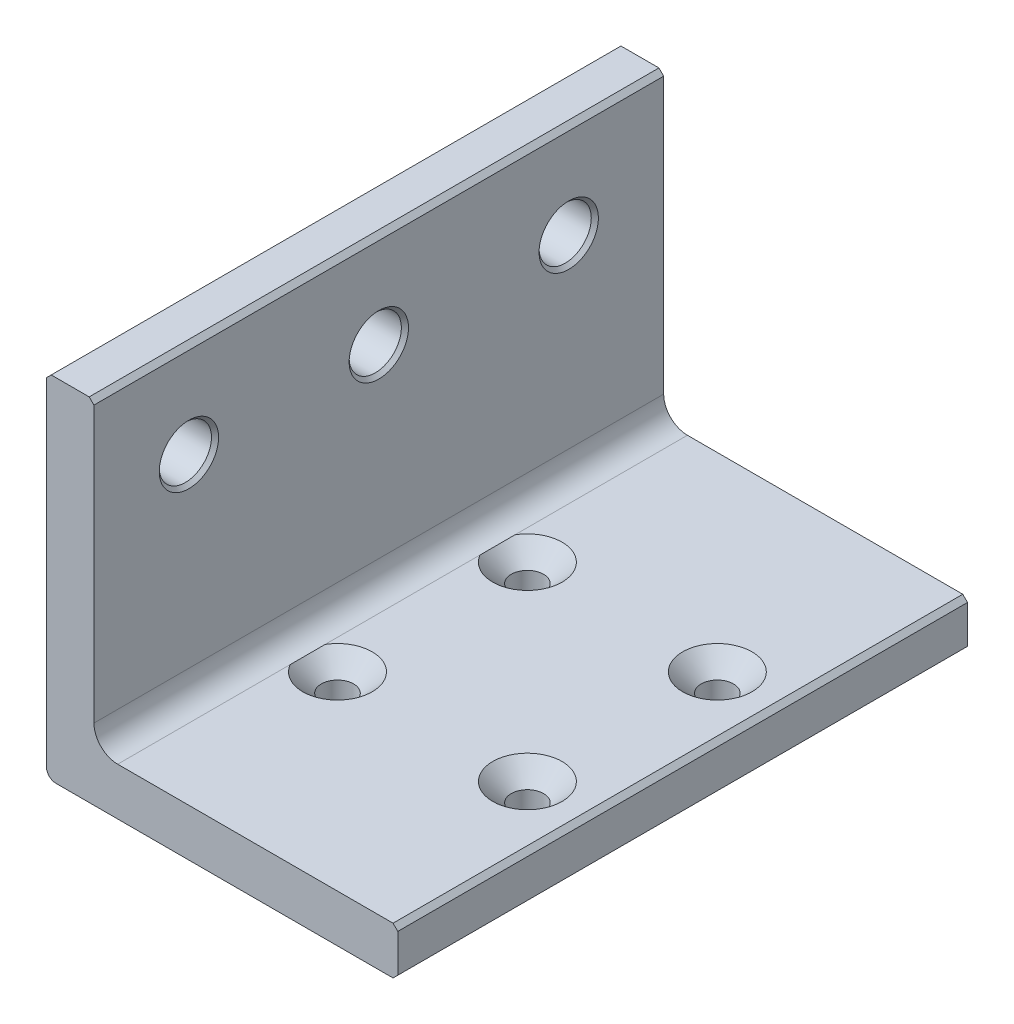
ISO-10303-21;
HEADER;
FILE_DESCRIPTION(('STEP AP214'),'2;1');
FILE_NAME('part.step','',(''),(''),'','','');
FILE_SCHEMA(('AUTOMOTIVE_DESIGN { 1 0 10303 214 1 1 1 1 }'));
ENDSEC;
DATA;
#1=APPLICATION_CONTEXT('core data for automotive mechanical design processes');
#2=APPLICATION_PROTOCOL_DEFINITION('international standard','automotive_design',2000,#1);
#3=PRODUCT_CONTEXT('',#1,'mechanical');
#4=PRODUCT('Part','Part','',(#3));
#5=PRODUCT_RELATED_PRODUCT_CATEGORY('part','',(#4));
#6=PRODUCT_DEFINITION_FORMATION('','',#4);
#7=PRODUCT_DEFINITION_CONTEXT('part definition',#1,'design');
#8=PRODUCT_DEFINITION('design','',#6,#7);
#9=PRODUCT_DEFINITION_SHAPE('','',#8);
#10=(LENGTH_UNIT() NAMED_UNIT(*) SI_UNIT(.MILLI.,.METRE.));
#11=(NAMED_UNIT(*) PLANE_ANGLE_UNIT() SI_UNIT($,.RADIAN.));
#12=(NAMED_UNIT(*) SI_UNIT($,.STERADIAN.) SOLID_ANGLE_UNIT());
#13=UNCERTAINTY_MEASURE_WITH_UNIT(LENGTH_MEASURE(1.E-05),#10,'distance_accuracy_value','');
#14=(GEOMETRIC_REPRESENTATION_CONTEXT(3) GLOBAL_UNCERTAINTY_ASSIGNED_CONTEXT((#13)) GLOBAL_UNIT_ASSIGNED_CONTEXT((#10,
#11,#12)) REPRESENTATION_CONTEXT('',''));
#15=CARTESIAN_POINT('',(0.,0.,0.));
#16=DIRECTION('',(0.,0.,1.));
#17=DIRECTION('',(1.,0.,0.));
#18=AXIS2_PLACEMENT_3D('',#15,#16,#17);
#19=CARTESIAN_POINT('',(14.5544718164469,-14.7922738190553,60.));
#20=DIRECTION('',(0.,-1.,0.));
#21=DIRECTION('',(1.,0.,0.));
#22=AXIS2_PLACEMENT_3D('',#19,#20,#21);
#23=PLANE('',#22);
#24=CARTESIAN_POINT('',(8.70447181644686,-14.7922738190553,40.));
#25=DIRECTION('',(0.,1.,0.));
#26=DIRECTION('',(0.,0.,1.));
#27=AXIS2_PLACEMENT_3D('',#24,#25,#26);
#28=CIRCLE('',#27,3.65);
#29=CARTESIAN_POINT('',(8.70447181644686,-14.7922738190553,43.65));
#30=VERTEX_POINT('',#29);
#31=EDGE_CURVE('E368',#30,#30,#28,.T.);
#32=ORIENTED_EDGE('',*,*,#31,.F.);
#33=EDGE_LOOP('',(#32));
#34=FACE_BOUND('',#33,.T.);
#35=DIRECTION('',(0.,0.,-1.));
#36=VECTOR('',#35,1.);
#37=CARTESIAN_POINT('',(-14.4455281835531,-14.7922738190553,60.));
#38=LINE('',#37,#36);
#39=CARTESIAN_POINT('',(-14.4455281835531,-14.7922738190553,38.1560911085414));
#40=VERTEX_POINT('',#39);
#41=CARTESIAN_POINT('',(-14.4455281835531,-14.7922738190553,21.8439088914586));
#42=VERTEX_POINT('',#41);
#43=EDGE_CURVE('E54',#40,#42,#38,.T.);
#44=ORIENTED_EDGE('',*,*,#43,.F.);
#45=CARTESIAN_POINT('',(-11.2955281835531,-14.7922738190553,40.));
#46=DIRECTION('',(0.,1.,0.));
#47=DIRECTION('',(0.,0.,1.));
#48=AXIS2_PLACEMENT_3D('',#45,#46,#47);
#49=CIRCLE('',#48,3.65);
#50=CARTESIAN_POINT('',(-14.4455281835531,-14.7922738190553,41.8439088914586));
#51=VERTEX_POINT('',#50);
#52=EDGE_CURVE('E133',#51,#40,#49,.T.);
#53=ORIENTED_EDGE('',*,*,#52,.F.);
#54=CARTESIAN_POINT('',(-14.4455281835531,-14.7922738190553,60.));
#55=VERTEX_POINT('',#54);
#56=EDGE_CURVE('E150',#55,#51,#38,.T.);
#57=ORIENTED_EDGE('',*,*,#56,.F.);
#58=DIRECTION('',(-1.,0.,0.));
#59=VECTOR('',#58,1.);
#60=CARTESIAN_POINT('',(14.5544718164469,-14.7922738190553,60.));
#61=LINE('',#60,#59);
#62=CARTESIAN_POINT('',(14.5544718164469,-14.7922738190553,60.));
#63=VERTEX_POINT('',#62);
#64=EDGE_CURVE('E157',#63,#55,#61,.T.);
#65=ORIENTED_EDGE('',*,*,#64,.F.);
#66=DIRECTION('',(0.,0.,-1.));
#67=VECTOR('',#66,1.);
#68=CARTESIAN_POINT('',(14.5544718164469,-14.7922738190553,60.));
#69=LINE('',#68,#67);
#70=CARTESIAN_POINT('',(14.5544718164469,-14.7922738190553,0.));
#71=VERTEX_POINT('',#70);
#72=EDGE_CURVE('E154',#63,#71,#69,.T.);
#73=ORIENTED_EDGE('',*,*,#72,.T.);
#74=DIRECTION('',(-1.,0.,0.));
#75=VECTOR('',#74,1.);
#76=CARTESIAN_POINT('',(14.5544718164469,-14.7922738190553,0.));
#77=LINE('',#76,#75);
#78=CARTESIAN_POINT('',(-14.4455281835531,-14.7922738190553,0.));
#79=VERTEX_POINT('',#78);
#80=EDGE_CURVE('E190',#71,#79,#77,.T.);
#81=ORIENTED_EDGE('',*,*,#80,.T.);
#82=CARTESIAN_POINT('',(-14.4455281835531,-14.7922738190553,18.1560911085414));
#83=VERTEX_POINT('',#82);
#84=EDGE_CURVE('E153',#83,#79,#38,.T.);
#85=ORIENTED_EDGE('',*,*,#84,.F.);
#86=CARTESIAN_POINT('',(-11.2955281835531,-14.7922738190553,20.));
#87=DIRECTION('',(0.,1.,0.));
#88=DIRECTION('',(0.,0.,1.));
#89=AXIS2_PLACEMENT_3D('',#86,#87,#88);
#90=CIRCLE('',#89,3.65);
#91=EDGE_CURVE('E147',#42,#83,#90,.T.);
#92=ORIENTED_EDGE('',*,*,#91,.F.);
#93=EDGE_LOOP('',(#44,#53,#57,#65,#73,#81,#85,#92));
#94=FACE_BOUND('',#93,.T.);
#95=CARTESIAN_POINT('',(8.70447181644686,-14.7922738190553,20.));
#96=DIRECTION('',(0.,1.,0.));
#97=DIRECTION('',(0.,0.,1.));
#98=AXIS2_PLACEMENT_3D('',#95,#96,#97);
#99=CIRCLE('',#98,3.65);
#100=CARTESIAN_POINT('',(8.70447181644686,-14.7922738190553,23.65));
#101=VERTEX_POINT('',#100);
#102=EDGE_CURVE('E380',#101,#101,#99,.T.);
#103=ORIENTED_EDGE('',*,*,#102,.F.);
#104=EDGE_LOOP('',(#103));
#105=FACE_BOUND('',#104,.T.);
#106=ADVANCED_FACE('F32',(#34,#94,#105),#23,.F.);
#107=CARTESIAN_POINT('',(-14.4455281835531,-12.2922738190553,60.));
#108=DIRECTION('',(0.,0.,-1.));
#109=DIRECTION('',(-1.,0.,0.));
#110=AXIS2_PLACEMENT_3D('',#107,#108,#109);
#111=CYLINDRICAL_SURFACE('',#110,2.5);
#112=CARTESIAN_POINT('',(-14.4455281835531,-12.2922738190553,0.));
#113=DIRECTION('',(0.,0.,-1.));
#114=DIRECTION('',(-1.,0.,0.));
#115=AXIS2_PLACEMENT_3D('',#112,#113,#114);
#116=CIRCLE('',#115,2.5);
#117=CARTESIAN_POINT('',(-16.9455281835531,-12.2922738190552,0.));
#118=VERTEX_POINT('',#117);
#119=EDGE_CURVE('E168',#79,#118,#116,.T.);
#120=ORIENTED_EDGE('',*,*,#119,.T.);
#121=DIRECTION('',(0.,0.,-1.));
#122=VECTOR('',#121,1.);
#123=CARTESIAN_POINT('',(-16.9455281835531,-12.2922738190552,60.));
#124=LINE('',#123,#122);
#125=CARTESIAN_POINT('',(-16.9455281835531,-12.2922738190552,60.));
#126=VERTEX_POINT('',#125);
#127=EDGE_CURVE('E11',#126,#118,#124,.T.);
#128=ORIENTED_EDGE('',*,*,#127,.F.);
#129=CARTESIAN_POINT('',(-14.4455281835531,-12.2922738190553,60.));
#130=DIRECTION('',(0.,0.,-1.));
#131=DIRECTION('',(-1.,0.,0.));
#132=AXIS2_PLACEMENT_3D('',#129,#130,#131);
#133=CIRCLE('',#132,2.5);
#134=EDGE_CURVE('E191',#55,#126,#133,.T.);
#135=ORIENTED_EDGE('',*,*,#134,.F.);
#136=ORIENTED_EDGE('',*,*,#56,.T.);
#137=EDGE_CURVE('E142',#51,#40,#38,.T.);
#138=ORIENTED_EDGE('',*,*,#137,.T.);
#139=ORIENTED_EDGE('',*,*,#43,.T.);
#140=EDGE_CURVE('E148',#42,#83,#38,.T.);
#141=ORIENTED_EDGE('',*,*,#140,.T.);
#142=ORIENTED_EDGE('',*,*,#84,.T.);
#143=EDGE_LOOP('',(#120,#128,#135,#136,#138,#139,#141,#142));
#144=FACE_BOUND('',#143,.T.);
#145=ADVANCED_FACE('F34',(#144),#111,.F.);
#146=CARTESIAN_POINT('',(-16.9455281835531,-12.2922738190552,60.));
#147=DIRECTION('',(-1.,0.,0.));
#148=DIRECTION('',(0.,-1.,0.));
#149=AXIS2_PLACEMENT_3D('',#146,#147,#148);
#150=PLANE('',#149);
#151=CARTESIAN_POINT('',(-16.9455281835531,7.20772618094474,50.));
#152=DIRECTION('',(1.,0.,0.));
#153=DIRECTION('',(0.,0.,-1.));
#154=AXIS2_PLACEMENT_3D('',#151,#152,#153);
#155=CIRCLE('',#154,3.125);
#156=CARTESIAN_POINT('',(-16.9455281835531,7.20772618094474,46.875));
#157=VERTEX_POINT('',#156);
#158=EDGE_CURVE('E336',#157,#157,#155,.T.);
#159=ORIENTED_EDGE('',*,*,#158,.F.);
#160=EDGE_LOOP('',(#159));
#161=FACE_BOUND('',#160,.T.);
#162=CARTESIAN_POINT('',(-16.9455281835531,7.20772618094474,30.));
#163=DIRECTION('',(1.,0.,0.));
#164=DIRECTION('',(0.,0.,-1.));
#165=AXIS2_PLACEMENT_3D('',#162,#163,#164);
#166=CIRCLE('',#165,3.125);
#167=CARTESIAN_POINT('',(-16.9455281835531,7.20772618094474,26.875));
#168=VERTEX_POINT('',#167);
#169=EDGE_CURVE('E340',#168,#168,#166,.T.);
#170=ORIENTED_EDGE('',*,*,#169,.F.);
#171=EDGE_LOOP('',(#170));
#172=FACE_BOUND('',#171,.T.);
#173=CARTESIAN_POINT('',(-16.9455281835531,7.20772618094474,9.99999999999999));
#174=DIRECTION('',(1.,0.,0.));
#175=DIRECTION('',(0.,0.,-1.));
#176=AXIS2_PLACEMENT_3D('',#173,#174,#175);
#177=CIRCLE('',#176,3.125);
#178=CARTESIAN_POINT('',(-16.9455281835531,7.20772618094474,6.87499999999999));
#179=VERTEX_POINT('',#178);
#180=EDGE_CURVE('E343',#179,#179,#177,.T.);
#181=ORIENTED_EDGE('',*,*,#180,.F.);
#182=EDGE_LOOP('',(#181));
#183=FACE_BOUND('',#182,.T.);
#184=DIRECTION('',(0.,1.,0.));
#185=VECTOR('',#184,1.);
#186=CARTESIAN_POINT('',(-16.9455281835531,-12.2922738190552,0.));
#187=LINE('',#186,#185);
#188=CARTESIAN_POINT('',(-16.9455281835531,16.7077261809447,0.));
#189=VERTEX_POINT('',#188);
#190=EDGE_CURVE('E170',#118,#189,#187,.T.);
#191=ORIENTED_EDGE('',*,*,#190,.T.);
#192=DIRECTION('',(0.,0.,-1.));
#193=VECTOR('',#192,1.);
#194=CARTESIAN_POINT('',(-16.9455281835531,16.7077261809447,60.));
#195=LINE('',#194,#193);
#196=CARTESIAN_POINT('',(-16.9455281835531,16.7077261809447,60.));
#197=VERTEX_POINT('',#196);
#198=EDGE_CURVE('E40',#197,#189,#195,.T.);
#199=ORIENTED_EDGE('',*,*,#198,.F.);
#200=DIRECTION('',(0.,1.,0.));
#201=VECTOR('',#200,1.);
#202=CARTESIAN_POINT('',(-16.9455281835531,-12.2922738190552,60.));
#203=LINE('',#202,#201);
#204=EDGE_CURVE('E195',#126,#197,#203,.T.);
#205=ORIENTED_EDGE('',*,*,#204,.F.);
#206=ORIENTED_EDGE('',*,*,#127,.T.);
#207=EDGE_LOOP('',(#191,#199,#205,#206));
#208=FACE_BOUND('',#207,.T.);
#209=ADVANCED_FACE('F234',(#161,#172,#183,#208),#150,.F.);
#210=CARTESIAN_POINT('',(-16.9455281835531,16.7077261809447,60.));
#211=DIRECTION('',(-0.707106781186547,-0.707106781186547,0.));
#212=DIRECTION('',(0.707106781186548,-0.707106781186548,0.));
#213=AXIS2_PLACEMENT_3D('',#210,#211,#212);
#214=PLANE('',#213);
#215=DIRECTION('',(-0.707106781186547,0.707106781186547,0.));
#216=VECTOR('',#215,1.);
#217=CARTESIAN_POINT('',(-16.9455281835531,16.7077261809447,0.));
#218=LINE('',#217,#216);
#219=CARTESIAN_POINT('',(-17.4455281835531,17.2077261809447,0.));
#220=VERTEX_POINT('',#219);
#221=EDGE_CURVE('E173',#189,#220,#218,.T.);
#222=ORIENTED_EDGE('',*,*,#221,.T.);
#223=DIRECTION('',(0.,0.,-1.));
#224=VECTOR('',#223,1.);
#225=CARTESIAN_POINT('',(-17.4455281835531,17.2077261809447,60.));
#226=LINE('',#225,#224);
#227=CARTESIAN_POINT('',(-17.4455281835531,17.2077261809447,60.));
#228=VERTEX_POINT('',#227);
#229=EDGE_CURVE('E243',#228,#220,#226,.T.);
#230=ORIENTED_EDGE('',*,*,#229,.F.);
#231=DIRECTION('',(-0.707106781186547,0.707106781186547,0.));
#232=VECTOR('',#231,1.);
#233=CARTESIAN_POINT('',(-16.9455281835531,16.7077261809447,60.));
#234=LINE('',#233,#232);
#235=EDGE_CURVE('E198',#197,#228,#234,.T.);
#236=ORIENTED_EDGE('',*,*,#235,.F.);
#237=ORIENTED_EDGE('',*,*,#198,.T.);
#238=EDGE_LOOP('',(#222,#230,#236,#237));
#239=FACE_BOUND('',#238,.T.);
#240=ADVANCED_FACE('F244',(#239),#214,.F.);
#241=CARTESIAN_POINT('',(-17.4455281835531,17.2077261809447,60.));
#242=DIRECTION('',(0.,-1.,0.));
#243=DIRECTION('',(0.,0.,-1.));
#244=AXIS2_PLACEMENT_3D('',#241,#242,#243);
#245=PLANE('',#244);
#246=DIRECTION('',(-1.,0.,0.));
#247=VECTOR('',#246,1.);
#248=CARTESIAN_POINT('',(-17.4455281835531,17.2077261809447,0.));
#249=LINE('',#248,#247);
#250=CARTESIAN_POINT('',(-21.4455281835531,17.2077261809447,0.));
#251=VERTEX_POINT('',#250);
#252=EDGE_CURVE('E175',#220,#251,#249,.T.);
#253=ORIENTED_EDGE('',*,*,#252,.T.);
#254=DIRECTION('',(0.,0.,-1.));
#255=VECTOR('',#254,1.);
#256=CARTESIAN_POINT('',(-21.4455281835531,17.2077261809447,60.));
#257=LINE('',#256,#255);
#258=CARTESIAN_POINT('',(-21.4455281835531,17.2077261809447,60.));
#259=VERTEX_POINT('',#258);
#260=EDGE_CURVE('E248',#259,#251,#257,.T.);
#261=ORIENTED_EDGE('',*,*,#260,.F.);
#262=DIRECTION('',(-1.,0.,0.));
#263=VECTOR('',#262,1.);
#264=CARTESIAN_POINT('',(-17.4455281835531,17.2077261809447,60.));
#265=LINE('',#264,#263);
#266=EDGE_CURVE('E204',#228,#259,#265,.T.);
#267=ORIENTED_EDGE('',*,*,#266,.F.);
#268=ORIENTED_EDGE('',*,*,#229,.T.);
#269=EDGE_LOOP('',(#253,#261,#267,#268));
#270=FACE_BOUND('',#269,.T.);
#271=ADVANCED_FACE('F250',(#270),#245,.F.);
#272=CARTESIAN_POINT('',(-21.4455281835531,17.2077261809447,60.));
#273=DIRECTION('',(0.707106781186547,-0.707106781186547,0.));
#274=DIRECTION('',(0.707106781186548,0.707106781186548,0.));
#275=AXIS2_PLACEMENT_3D('',#272,#273,#274);
#276=PLANE('',#275);
#277=DIRECTION('',(-0.707106781186547,-0.707106781186547,0.));
#278=VECTOR('',#277,1.);
#279=CARTESIAN_POINT('',(-21.4455281835531,17.2077261809447,0.));
#280=LINE('',#279,#278);
#281=CARTESIAN_POINT('',(-21.9455281835531,16.7077261809447,0.));
#282=VERTEX_POINT('',#281);
#283=EDGE_CURVE('E177',#251,#282,#280,.T.);
#284=ORIENTED_EDGE('',*,*,#283,.T.);
#285=DIRECTION('',(0.,0.,-1.));
#286=VECTOR('',#285,1.);
#287=CARTESIAN_POINT('',(-21.9455281835531,16.7077261809447,60.));
#288=LINE('',#287,#286);
#289=CARTESIAN_POINT('',(-21.9455281835531,16.7077261809447,60.));
#290=VERTEX_POINT('',#289);
#291=EDGE_CURVE('E255',#290,#282,#288,.T.);
#292=ORIENTED_EDGE('',*,*,#291,.F.);
#293=DIRECTION('',(-0.707106781186547,-0.707106781186547,0.));
#294=VECTOR('',#293,1.);
#295=CARTESIAN_POINT('',(-21.4455281835531,17.2077261809447,60.));
#296=LINE('',#295,#294);
#297=EDGE_CURVE('E206',#259,#290,#296,.T.);
#298=ORIENTED_EDGE('',*,*,#297,.F.);
#299=ORIENTED_EDGE('',*,*,#260,.T.);
#300=EDGE_LOOP('',(#284,#292,#298,#299));
#301=FACE_BOUND('',#300,.T.);
#302=ADVANCED_FACE('F258',(#301),#276,.F.);
#303=CARTESIAN_POINT('',(-21.9455281835531,16.7077261809447,60.));
#304=DIRECTION('',(1.,0.,0.));
#305=DIRECTION('',(0.,1.,0.));
#306=AXIS2_PLACEMENT_3D('',#303,#304,#305);
#307=PLANE('',#306);
#308=CARTESIAN_POINT('',(-21.9455281835531,7.20772618094474,50.));
#309=DIRECTION('',(1.,0.,0.));
#310=DIRECTION('',(0.,0.,-1.));
#311=AXIS2_PLACEMENT_3D('',#308,#309,#310);
#312=CIRCLE('',#311,3.125);
#313=CARTESIAN_POINT('',(-21.9455281835531,7.20772618094474,46.875));
#314=VERTEX_POINT('',#313);
#315=EDGE_CURVE('E492',#314,#314,#312,.T.);
#316=ORIENTED_EDGE('',*,*,#315,.T.);
#317=EDGE_LOOP('',(#316));
#318=FACE_BOUND('',#317,.T.);
#319=CARTESIAN_POINT('',(-21.9455281835531,7.20772618094474,30.));
#320=DIRECTION('',(1.,0.,0.));
#321=DIRECTION('',(0.,0.,-1.));
#322=AXIS2_PLACEMENT_3D('',#319,#320,#321);
#323=CIRCLE('',#322,3.125);
#324=CARTESIAN_POINT('',(-21.9455281835531,7.20772618094474,26.875));
#325=VERTEX_POINT('',#324);
#326=EDGE_CURVE('E501',#325,#325,#323,.T.);
#327=ORIENTED_EDGE('',*,*,#326,.T.);
#328=EDGE_LOOP('',(#327));
#329=FACE_BOUND('',#328,.T.);
#330=CARTESIAN_POINT('',(-21.9455281835531,7.20772618094474,9.99999999999999));
#331=DIRECTION('',(1.,0.,0.));
#332=DIRECTION('',(0.,0.,-1.));
#333=AXIS2_PLACEMENT_3D('',#330,#331,#332);
#334=CIRCLE('',#333,3.125);
#335=CARTESIAN_POINT('',(-21.9455281835531,7.20772618094474,6.87499999999999));
#336=VERTEX_POINT('',#335);
#337=EDGE_CURVE('E346',#336,#336,#334,.T.);
#338=ORIENTED_EDGE('',*,*,#337,.T.);
#339=EDGE_LOOP('',(#338));
#340=FACE_BOUND('',#339,.T.);
#341=DIRECTION('',(0.,-1.,0.));
#342=VECTOR('',#341,1.);
#343=CARTESIAN_POINT('',(-21.9455281835531,16.7077261809447,0.));
#344=LINE('',#343,#342);
#345=CARTESIAN_POINT('',(-21.9455281835531,-18.7922738190552,0.));
#346=VERTEX_POINT('',#345);
#347=EDGE_CURVE('E179',#282,#346,#344,.T.);
#348=ORIENTED_EDGE('',*,*,#347,.T.);
#349=DIRECTION('',(0.,0.,-1.));
#350=VECTOR('',#349,1.);
#351=CARTESIAN_POINT('',(-21.9455281835531,-18.7922738190552,60.));
#352=LINE('',#351,#350);
#353=CARTESIAN_POINT('',(-21.9455281835531,-18.7922738190552,60.));
#354=VERTEX_POINT('',#353);
#355=EDGE_CURVE('E266',#354,#346,#352,.T.);
#356=ORIENTED_EDGE('',*,*,#355,.F.);
#357=DIRECTION('',(0.,-1.,0.));
#358=VECTOR('',#357,1.);
#359=CARTESIAN_POINT('',(-21.9455281835531,16.7077261809447,60.));
#360=LINE('',#359,#358);
#361=EDGE_CURVE('E208',#290,#354,#360,.T.);
#362=ORIENTED_EDGE('',*,*,#361,.F.);
#363=ORIENTED_EDGE('',*,*,#291,.T.);
#364=EDGE_LOOP('',(#348,#356,#362,#363));
#365=FACE_BOUND('',#364,.T.);
#366=ADVANCED_FACE('F267',(#318,#329,#340,#365),#307,.F.);
#367=CARTESIAN_POINT('',(-20.9455281835531,-18.7922738190553,60.));
#368=DIRECTION('',(0.,0.,-1.));
#369=DIRECTION('',(-1.,0.,0.));
#370=AXIS2_PLACEMENT_3D('',#367,#368,#369);
#371=CYLINDRICAL_SURFACE('',#370,1.);
#372=CARTESIAN_POINT('',(-20.9455281835531,-18.7922738190553,0.));
#373=DIRECTION('',(0.,0.,1.));
#374=DIRECTION('',(1.,0.,0.));
#375=AXIS2_PLACEMENT_3D('',#372,#373,#374);
#376=CIRCLE('',#375,1.);
#377=CARTESIAN_POINT('',(-20.9455281835531,-19.7922738190553,0.));
#378=VERTEX_POINT('',#377);
#379=EDGE_CURVE('E181',#346,#378,#376,.T.);
#380=ORIENTED_EDGE('',*,*,#379,.T.);
#381=DIRECTION('',(0.,0.,-1.));
#382=VECTOR('',#381,1.);
#383=CARTESIAN_POINT('',(-20.9455281835531,-19.7922738190553,60.));
#384=LINE('',#383,#382);
#385=CARTESIAN_POINT('',(-20.9455281835531,-19.7922738190553,60.));
#386=VERTEX_POINT('',#385);
#387=EDGE_CURVE('E271',#386,#378,#384,.T.);
#388=ORIENTED_EDGE('',*,*,#387,.F.);
#389=CARTESIAN_POINT('',(-20.9455281835531,-18.7922738190553,60.));
#390=DIRECTION('',(0.,0.,1.));
#391=DIRECTION('',(1.,0.,0.));
#392=AXIS2_PLACEMENT_3D('',#389,#390,#391);
#393=CIRCLE('',#392,1.);
#394=EDGE_CURVE('E210',#354,#386,#393,.T.);
#395=ORIENTED_EDGE('',*,*,#394,.F.);
#396=ORIENTED_EDGE('',*,*,#355,.T.);
#397=EDGE_LOOP('',(#380,#388,#395,#396));
#398=FACE_BOUND('',#397,.T.);
#399=ADVANCED_FACE('F273',(#398),#371,.T.);
#400=CARTESIAN_POINT('',(-20.9455281835531,-19.7922738190553,60.));
#401=DIRECTION('',(0.,1.,0.));
#402=DIRECTION('',(0.,0.,1.));
#403=AXIS2_PLACEMENT_3D('',#400,#401,#402);
#404=PLANE('',#403);
#405=CARTESIAN_POINT('',(-11.2955281835531,-19.7922738190553,40.));
#406=DIRECTION('',(0.,1.,0.));
#407=DIRECTION('',(0.,0.,1.));
#408=AXIS2_PLACEMENT_3D('',#405,#406,#407);
#409=CIRCLE('',#408,2.);
#410=CARTESIAN_POINT('',(-11.2955281835531,-19.7922738190553,42.));
#411=VERTEX_POINT('',#410);
#412=EDGE_CURVE('E138',#411,#411,#409,.T.);
#413=ORIENTED_EDGE('',*,*,#412,.T.);
#414=EDGE_LOOP('',(#413));
#415=FACE_BOUND('',#414,.T.);
#416=CARTESIAN_POINT('',(8.70447181644686,-19.7922738190553,40.));
#417=DIRECTION('',(0.,1.,0.));
#418=DIRECTION('',(0.,0.,1.));
#419=AXIS2_PLACEMENT_3D('',#416,#417,#418);
#420=CIRCLE('',#419,2.);
#421=CARTESIAN_POINT('',(8.70447181644686,-19.7922738190553,42.));
#422=VERTEX_POINT('',#421);
#423=EDGE_CURVE('E365',#422,#422,#420,.T.);
#424=ORIENTED_EDGE('',*,*,#423,.T.);
#425=EDGE_LOOP('',(#424));
#426=FACE_BOUND('',#425,.T.);
#427=CARTESIAN_POINT('',(8.70447181644686,-19.7922738190553,20.));
#428=DIRECTION('',(0.,1.,0.));
#429=DIRECTION('',(0.,0.,1.));
#430=AXIS2_PLACEMENT_3D('',#427,#428,#429);
#431=CIRCLE('',#430,2.);
#432=CARTESIAN_POINT('',(8.70447181644686,-19.7922738190553,22.));
#433=VERTEX_POINT('',#432);
#434=EDGE_CURVE('E377',#433,#433,#431,.T.);
#435=ORIENTED_EDGE('',*,*,#434,.T.);
#436=EDGE_LOOP('',(#435));
#437=FACE_BOUND('',#436,.T.);
#438=CARTESIAN_POINT('',(-11.2955281835531,-19.7922738190553,20.));
#439=DIRECTION('',(0.,1.,0.));
#440=DIRECTION('',(0.,0.,1.));
#441=AXIS2_PLACEMENT_3D('',#438,#439,#440);
#442=CIRCLE('',#441,2.);
#443=CARTESIAN_POINT('',(-11.2955281835531,-19.7922738190553,22.));
#444=VERTEX_POINT('',#443);
#445=EDGE_CURVE('E389',#444,#444,#442,.T.);
#446=ORIENTED_EDGE('',*,*,#445,.T.);
#447=EDGE_LOOP('',(#446));
#448=FACE_BOUND('',#447,.T.);
#449=DIRECTION('',(1.,0.,0.));
#450=VECTOR('',#449,1.);
#451=CARTESIAN_POINT('',(-20.9455281835531,-19.7922738190553,0.));
#452=LINE('',#451,#450);
#453=CARTESIAN_POINT('',(14.5544718164469,-19.7922738190553,0.));
#454=VERTEX_POINT('',#453);
#455=EDGE_CURVE('E183',#378,#454,#452,.T.);
#456=ORIENTED_EDGE('',*,*,#455,.T.);
#457=DIRECTION('',(0.,0.,-1.));
#458=VECTOR('',#457,1.);
#459=CARTESIAN_POINT('',(14.5544718164469,-19.7922738190553,60.));
#460=LINE('',#459,#458);
#461=CARTESIAN_POINT('',(14.5544718164469,-19.7922738190553,60.));
#462=VERTEX_POINT('',#461);
#463=EDGE_CURVE('E278',#462,#454,#460,.T.);
#464=ORIENTED_EDGE('',*,*,#463,.F.);
#465=DIRECTION('',(1.,0.,0.));
#466=VECTOR('',#465,1.);
#467=CARTESIAN_POINT('',(-20.9455281835531,-19.7922738190553,60.));
#468=LINE('',#467,#466);
#469=EDGE_CURVE('E212',#386,#462,#468,.T.);
#470=ORIENTED_EDGE('',*,*,#469,.F.);
#471=ORIENTED_EDGE('',*,*,#387,.T.);
#472=EDGE_LOOP('',(#456,#464,#470,#471));
#473=FACE_BOUND('',#472,.T.);
#474=ADVANCED_FACE('F281',(#415,#426,#437,#448,#473),#404,.F.);
#475=CARTESIAN_POINT('',(14.5544718164469,-19.7922738190553,60.));
#476=DIRECTION('',(-0.707106781186547,0.707106781186547,0.));
#477=DIRECTION('',(-0.707106781186548,-0.707106781186548,0.));
#478=AXIS2_PLACEMENT_3D('',#475,#476,#477);
#479=PLANE('',#478);
#480=DIRECTION('',(0.707106781186547,0.707106781186547,0.));
#481=VECTOR('',#480,1.);
#482=CARTESIAN_POINT('',(14.5544718164469,-19.7922738190553,0.));
#483=LINE('',#482,#481);
#484=CARTESIAN_POINT('',(15.0544718164469,-19.2922738190553,0.));
#485=VERTEX_POINT('',#484);
#486=EDGE_CURVE('E185',#454,#485,#483,.T.);
#487=ORIENTED_EDGE('',*,*,#486,.T.);
#488=DIRECTION('',(0.,0.,-1.));
#489=VECTOR('',#488,1.);
#490=CARTESIAN_POINT('',(15.0544718164469,-19.2922738190553,60.));
#491=LINE('',#490,#489);
#492=CARTESIAN_POINT('',(15.0544718164469,-19.2922738190553,60.));
#493=VERTEX_POINT('',#492);
#494=EDGE_CURVE('E230',#493,#485,#491,.T.);
#495=ORIENTED_EDGE('',*,*,#494,.F.);
#496=DIRECTION('',(0.707106781186547,0.707106781186547,0.));
#497=VECTOR('',#496,1.);
#498=CARTESIAN_POINT('',(14.5544718164469,-19.7922738190553,60.));
#499=LINE('',#498,#497);
#500=EDGE_CURVE('E214',#462,#493,#499,.T.);
#501=ORIENTED_EDGE('',*,*,#500,.F.);
#502=ORIENTED_EDGE('',*,*,#463,.T.);
#503=EDGE_LOOP('',(#487,#495,#501,#502));
#504=FACE_BOUND('',#503,.T.);
#505=ADVANCED_FACE('F286',(#504),#479,.F.);
#506=CARTESIAN_POINT('',(15.0544718164469,-19.2922738190553,60.));
#507=DIRECTION('',(-1.,0.,0.));
#508=DIRECTION('',(0.,0.,1.));
#509=AXIS2_PLACEMENT_3D('',#506,#507,#508);
#510=PLANE('',#509);
#511=DIRECTION('',(0.,1.,0.));
#512=VECTOR('',#511,1.);
#513=CARTESIAN_POINT('',(15.0544718164469,-19.2922738190553,0.));
#514=LINE('',#513,#512);
#515=CARTESIAN_POINT('',(15.0544718164469,-15.2922738190553,0.));
#516=VERTEX_POINT('',#515);
#517=EDGE_CURVE('E187',#485,#516,#514,.T.);
#518=ORIENTED_EDGE('',*,*,#517,.T.);
#519=DIRECTION('',(0.,0.,-1.));
#520=VECTOR('',#519,1.);
#521=CARTESIAN_POINT('',(15.0544718164469,-15.2922738190553,60.));
#522=LINE('',#521,#520);
#523=CARTESIAN_POINT('',(15.0544718164469,-15.2922738190553,60.));
#524=VERTEX_POINT('',#523);
#525=EDGE_CURVE('E225',#524,#516,#522,.T.);
#526=ORIENTED_EDGE('',*,*,#525,.F.);
#527=DIRECTION('',(0.,1.,0.));
#528=VECTOR('',#527,1.);
#529=CARTESIAN_POINT('',(15.0544718164469,-19.2922738190553,60.));
#530=LINE('',#529,#528);
#531=EDGE_CURVE('E164',#493,#524,#530,.T.);
#532=ORIENTED_EDGE('',*,*,#531,.F.);
#533=ORIENTED_EDGE('',*,*,#494,.T.);
#534=EDGE_LOOP('',(#518,#526,#532,#533));
#535=FACE_BOUND('',#534,.T.);
#536=ADVANCED_FACE('F226',(#535),#510,.F.);
#537=CARTESIAN_POINT('',(15.0544718164469,-15.2922738190553,60.));
#538=DIRECTION('',(-0.707106781186547,-0.707106781186547,0.));
#539=DIRECTION('',(0.707106781186548,-0.707106781186548,0.));
#540=AXIS2_PLACEMENT_3D('',#537,#538,#539);
#541=PLANE('',#540);
#542=DIRECTION('',(-0.707106781186547,0.707106781186547,0.));
#543=VECTOR('',#542,1.);
#544=CARTESIAN_POINT('',(15.0544718164469,-15.2922738190553,0.));
#545=LINE('',#544,#543);
#546=EDGE_CURVE('E189',#516,#71,#545,.T.);
#547=ORIENTED_EDGE('',*,*,#546,.T.);
#548=ORIENTED_EDGE('',*,*,#72,.F.);
#549=DIRECTION('',(-0.707106781186547,0.707106781186547,0.));
#550=VECTOR('',#549,1.);
#551=CARTESIAN_POINT('',(15.0544718164469,-15.2922738190553,60.));
#552=LINE('',#551,#550);
#553=EDGE_CURVE('E159',#524,#63,#552,.T.);
#554=ORIENTED_EDGE('',*,*,#553,.F.);
#555=ORIENTED_EDGE('',*,*,#525,.T.);
#556=EDGE_LOOP('',(#547,#548,#554,#555));
#557=FACE_BOUND('',#556,.T.);
#558=ADVANCED_FACE('F232',(#557),#541,.F.);
#559=CARTESIAN_POINT('',(-14.4455281835531,-12.2922738190553,60.));
#560=DIRECTION('',(0.,0.,-1.));
#561=DIRECTION('',(-1.,0.,0.));
#562=AXIS2_PLACEMENT_3D('',#559,#560,#561);
#563=PLANE('',#562);
#564=ORIENTED_EDGE('',*,*,#134,.T.);
#565=ORIENTED_EDGE('',*,*,#204,.T.);
#566=ORIENTED_EDGE('',*,*,#235,.T.);
#567=ORIENTED_EDGE('',*,*,#266,.T.);
#568=ORIENTED_EDGE('',*,*,#297,.T.);
#569=ORIENTED_EDGE('',*,*,#361,.T.);
#570=ORIENTED_EDGE('',*,*,#394,.T.);
#571=ORIENTED_EDGE('',*,*,#469,.T.);
#572=ORIENTED_EDGE('',*,*,#500,.T.);
#573=ORIENTED_EDGE('',*,*,#531,.T.);
#574=ORIENTED_EDGE('',*,*,#553,.T.);
#575=ORIENTED_EDGE('',*,*,#64,.T.);
#576=EDGE_LOOP('',(#564,#565,#566,#567,#568,#569,#570,#571,#572,#573,#574,#575));
#577=FACE_BOUND('',#576,.T.);
#578=ADVANCED_FACE('F217',(#577),#563,.F.);
#579=CARTESIAN_POINT('',(-14.4455281835531,-12.2922738190553,0.));
#580=DIRECTION('',(0.,0.,-1.));
#581=DIRECTION('',(-1.,0.,0.));
#582=AXIS2_PLACEMENT_3D('',#579,#580,#581);
#583=PLANE('',#582);
#584=ORIENTED_EDGE('',*,*,#119,.F.);
#585=ORIENTED_EDGE('',*,*,#80,.F.);
#586=ORIENTED_EDGE('',*,*,#546,.F.);
#587=ORIENTED_EDGE('',*,*,#517,.F.);
#588=ORIENTED_EDGE('',*,*,#486,.F.);
#589=ORIENTED_EDGE('',*,*,#455,.F.);
#590=ORIENTED_EDGE('',*,*,#379,.F.);
#591=ORIENTED_EDGE('',*,*,#347,.F.);
#592=ORIENTED_EDGE('',*,*,#283,.F.);
#593=ORIENTED_EDGE('',*,*,#252,.F.);
#594=ORIENTED_EDGE('',*,*,#221,.F.);
#595=ORIENTED_EDGE('',*,*,#190,.F.);
#596=EDGE_LOOP('',(#584,#585,#586,#587,#588,#589,#590,#591,#592,#593,#594,#595));
#597=FACE_BOUND('',#596,.T.);
#598=ADVANCED_FACE('F290',(#597),#583,.T.);
#599=CARTESIAN_POINT('',(-7.64552818355314,-14.7922738190553,20.));
#600=DIRECTION('',(0.,1.,0.));
#601=DIRECTION('',(0.,0.,1.));
#602=AXIS2_PLACEMENT_3D('',#599,#600,#601);
#603=PLANE('',#602);
#604=EDGE_CURVE('E392',#83,#42,#90,.T.);
#605=ORIENTED_EDGE('',*,*,#604,.F.);
#606=ORIENTED_EDGE('',*,*,#140,.F.);
#607=EDGE_LOOP('',(#605,#606));
#608=FACE_BOUND('',#607,.T.);
#609=ADVANCED_FACE('F292',(#608),#603,.F.);
#610=CARTESIAN_POINT('',(-11.2955281835531,-19.4922738190553,20.));
#611=DIRECTION('',(0.,-1.,0.));
#612=DIRECTION('',(0.,0.,-1.));
#613=AXIS2_PLACEMENT_3D('',#610,#611,#612);
#614=CONICAL_SURFACE('',#613,1.7,0.785398163397448);
#615=ORIENTED_EDGE('',*,*,#445,.F.);
#616=EDGE_LOOP('',(#615));
#617=FACE_BOUND('',#616,.T.);
#618=CARTESIAN_POINT('',(-11.2955281835531,-19.4922738190553,20.));
#619=DIRECTION('',(0.,1.,0.));
#620=DIRECTION('',(0.,0.,1.));
#621=AXIS2_PLACEMENT_3D('',#618,#619,#620);
#622=CIRCLE('',#621,1.7);
#623=CARTESIAN_POINT('',(-11.2955281835531,-19.4922738190553,21.7));
#624=VERTEX_POINT('',#623);
#625=EDGE_CURVE('E171',#624,#624,#622,.T.);
#626=ORIENTED_EDGE('',*,*,#625,.T.);
#627=EDGE_LOOP('',(#626));
#628=FACE_BOUND('',#627,.T.);
#629=ADVANCED_FACE('F298',(#617,#628),#614,.F.);
#630=CARTESIAN_POINT('',(-11.2955281835531,-14.7922738190553,20.));
#631=DIRECTION('',(0.,1.,0.));
#632=DIRECTION('',(0.,0.,1.));
#633=AXIS2_PLACEMENT_3D('',#630,#631,#632);
#634=CYLINDRICAL_SURFACE('',#633,1.7);
#635=ORIENTED_EDGE('',*,*,#625,.F.);
#636=EDGE_LOOP('',(#635));
#637=FACE_BOUND('',#636,.T.);
#638=CARTESIAN_POINT('',(-11.2955281835531,-16.7422738190553,20.));
#639=DIRECTION('',(0.,1.,0.));
#640=DIRECTION('',(0.,0.,1.));
#641=AXIS2_PLACEMENT_3D('',#638,#639,#640);
#642=CIRCLE('',#641,1.7);
#643=CARTESIAN_POINT('',(-11.2955281835531,-16.7422738190553,21.7));
#644=VERTEX_POINT('',#643);
#645=EDGE_CURVE('E393',#644,#644,#642,.T.);
#646=ORIENTED_EDGE('',*,*,#645,.T.);
#647=EDGE_LOOP('',(#646));
#648=FACE_BOUND('',#647,.T.);
#649=ADVANCED_FACE('F401',(#637,#648),#634,.F.);
#650=CARTESIAN_POINT('',(-11.2955281835531,-14.7922738190553,20.));
#651=DIRECTION('',(0.,1.,0.));
#652=DIRECTION('',(0.,0.,1.));
#653=AXIS2_PLACEMENT_3D('',#650,#651,#652);
#654=CONICAL_SURFACE('',#653,3.65,0.785398163397448);
#655=ORIENTED_EDGE('',*,*,#645,.F.);
#656=EDGE_LOOP('',(#655));
#657=FACE_BOUND('',#656,.T.);
#658=ORIENTED_EDGE('',*,*,#604,.T.);
#659=ORIENTED_EDGE('',*,*,#91,.T.);
#660=EDGE_LOOP('',(#658,#659));
#661=FACE_BOUND('',#660,.T.);
#662=ADVANCED_FACE('F403',(#657,#661),#654,.F.);
#663=CARTESIAN_POINT('',(8.70447181644686,-19.4922738190552,20.));
#664=DIRECTION('',(0.,-1.,0.));
#665=DIRECTION('',(0.,0.,-1.));
#666=AXIS2_PLACEMENT_3D('',#663,#664,#665);
#667=CONICAL_SURFACE('',#666,1.7,0.785398163397448);
#668=ORIENTED_EDGE('',*,*,#434,.F.);
#669=EDGE_LOOP('',(#668));
#670=FACE_BOUND('',#669,.T.);
#671=CARTESIAN_POINT('',(8.70447181644686,-19.4922738190552,20.));
#672=DIRECTION('',(0.,1.,0.));
#673=DIRECTION('',(0.,0.,1.));
#674=AXIS2_PLACEMENT_3D('',#671,#672,#673);
#675=CIRCLE('',#674,1.7);
#676=CARTESIAN_POINT('',(8.70447181644686,-19.4922738190552,21.7));
#677=VERTEX_POINT('',#676);
#678=EDGE_CURVE('E386',#677,#677,#675,.T.);
#679=ORIENTED_EDGE('',*,*,#678,.T.);
#680=EDGE_LOOP('',(#679));
#681=FACE_BOUND('',#680,.T.);
#682=ADVANCED_FACE('F409',(#670,#681),#667,.F.);
#683=CARTESIAN_POINT('',(8.70447181644686,-14.7922738190553,20.));
#684=DIRECTION('',(0.,1.,0.));
#685=DIRECTION('',(0.,0.,1.));
#686=AXIS2_PLACEMENT_3D('',#683,#684,#685);
#687=CYLINDRICAL_SURFACE('',#686,1.7);
#688=ORIENTED_EDGE('',*,*,#678,.F.);
#689=EDGE_LOOP('',(#688));
#690=FACE_BOUND('',#689,.T.);
#691=CARTESIAN_POINT('',(8.70447181644686,-16.7422738190553,20.));
#692=DIRECTION('',(0.,1.,0.));
#693=DIRECTION('',(0.,0.,1.));
#694=AXIS2_PLACEMENT_3D('',#691,#692,#693);
#695=CIRCLE('',#694,1.7);
#696=CARTESIAN_POINT('',(8.70447181644686,-16.7422738190553,21.7));
#697=VERTEX_POINT('',#696);
#698=EDGE_CURVE('E383',#697,#697,#695,.T.);
#699=ORIENTED_EDGE('',*,*,#698,.T.);
#700=EDGE_LOOP('',(#699));
#701=FACE_BOUND('',#700,.T.);
#702=ADVANCED_FACE('F417',(#690,#701),#687,.F.);
#703=CARTESIAN_POINT('',(8.70447181644686,-14.7922738190553,20.));
#704=DIRECTION('',(0.,1.,0.));
#705=DIRECTION('',(0.,0.,1.));
#706=AXIS2_PLACEMENT_3D('',#703,#704,#705);
#707=CONICAL_SURFACE('',#706,3.65,0.785398163397448);
#708=ORIENTED_EDGE('',*,*,#698,.F.);
#709=EDGE_LOOP('',(#708));
#710=FACE_BOUND('',#709,.T.);
#711=ORIENTED_EDGE('',*,*,#102,.T.);
#712=EDGE_LOOP('',(#711));
#713=FACE_BOUND('',#712,.T.);
#714=ADVANCED_FACE('F421',(#710,#713),#707,.F.);
#715=CARTESIAN_POINT('',(8.70447181644686,-19.4922738190552,40.));
#716=DIRECTION('',(0.,-1.,0.));
#717=DIRECTION('',(0.,0.,-1.));
#718=AXIS2_PLACEMENT_3D('',#715,#716,#717);
#719=CONICAL_SURFACE('',#718,1.7,0.785398163397448);
#720=ORIENTED_EDGE('',*,*,#423,.F.);
#721=EDGE_LOOP('',(#720));
#722=FACE_BOUND('',#721,.T.);
#723=CARTESIAN_POINT('',(8.70447181644686,-19.4922738190552,40.));
#724=DIRECTION('',(0.,1.,0.));
#725=DIRECTION('',(0.,0.,1.));
#726=AXIS2_PLACEMENT_3D('',#723,#724,#725);
#727=CIRCLE('',#726,1.7);
#728=CARTESIAN_POINT('',(8.70447181644686,-19.4922738190552,41.7));
#729=VERTEX_POINT('',#728);
#730=EDGE_CURVE('E374',#729,#729,#727,.T.);
#731=ORIENTED_EDGE('',*,*,#730,.T.);
#732=EDGE_LOOP('',(#731));
#733=FACE_BOUND('',#732,.T.);
#734=ADVANCED_FACE('F425',(#722,#733),#719,.F.);
#735=CARTESIAN_POINT('',(8.70447181644686,-14.7922738190553,40.));
#736=DIRECTION('',(0.,1.,0.));
#737=DIRECTION('',(0.,0.,1.));
#738=AXIS2_PLACEMENT_3D('',#735,#736,#737);
#739=CYLINDRICAL_SURFACE('',#738,1.7);
#740=ORIENTED_EDGE('',*,*,#730,.F.);
#741=EDGE_LOOP('',(#740));
#742=FACE_BOUND('',#741,.T.);
#743=CARTESIAN_POINT('',(8.70447181644686,-16.7422738190553,40.));
#744=DIRECTION('',(0.,1.,0.));
#745=DIRECTION('',(0.,0.,1.));
#746=AXIS2_PLACEMENT_3D('',#743,#744,#745);
#747=CIRCLE('',#746,1.7);
#748=CARTESIAN_POINT('',(8.70447181644686,-16.7422738190553,41.7));
#749=VERTEX_POINT('',#748);
#750=EDGE_CURVE('E371',#749,#749,#747,.T.);
#751=ORIENTED_EDGE('',*,*,#750,.T.);
#752=EDGE_LOOP('',(#751));
#753=FACE_BOUND('',#752,.T.);
#754=ADVANCED_FACE('F429',(#742,#753),#739,.F.);
#755=CARTESIAN_POINT('',(8.70447181644686,-14.7922738190553,40.));
#756=DIRECTION('',(0.,1.,0.));
#757=DIRECTION('',(0.,0.,1.));
#758=AXIS2_PLACEMENT_3D('',#755,#756,#757);
#759=CONICAL_SURFACE('',#758,3.65,0.785398163397448);
#760=ORIENTED_EDGE('',*,*,#750,.F.);
#761=EDGE_LOOP('',(#760));
#762=FACE_BOUND('',#761,.T.);
#763=ORIENTED_EDGE('',*,*,#31,.T.);
#764=EDGE_LOOP('',(#763));
#765=FACE_BOUND('',#764,.T.);
#766=ADVANCED_FACE('F433',(#762,#765),#759,.F.);
#767=CARTESIAN_POINT('',(-7.64552818355314,-14.7922738190553,40.));
#768=DIRECTION('',(0.,1.,0.));
#769=DIRECTION('',(0.,0.,1.));
#770=AXIS2_PLACEMENT_3D('',#767,#768,#769);
#771=PLANE('',#770);
#772=ORIENTED_EDGE('',*,*,#137,.F.);
#773=EDGE_CURVE('E46',#40,#51,#49,.T.);
#774=ORIENTED_EDGE('',*,*,#773,.F.);
#775=EDGE_LOOP('',(#772,#774));
#776=FACE_BOUND('',#775,.T.);
#777=ADVANCED_FACE('F141',(#776),#771,.F.);
#778=CARTESIAN_POINT('',(-11.2955281835531,-19.4922738190553,40.));
#779=DIRECTION('',(0.,-1.,0.));
#780=DIRECTION('',(0.,0.,-1.));
#781=AXIS2_PLACEMENT_3D('',#778,#779,#780);
#782=CONICAL_SURFACE('',#781,1.7,0.785398163397448);
#783=ORIENTED_EDGE('',*,*,#412,.F.);
#784=EDGE_LOOP('',(#783));
#785=FACE_BOUND('',#784,.T.);
#786=CARTESIAN_POINT('',(-11.2955281835531,-19.4922738190553,40.));
#787=DIRECTION('',(0.,1.,0.));
#788=DIRECTION('',(0.,0.,1.));
#789=AXIS2_PLACEMENT_3D('',#786,#787,#788);
#790=CIRCLE('',#789,1.7);
#791=CARTESIAN_POINT('',(-11.2955281835531,-19.4922738190553,41.7));
#792=VERTEX_POINT('',#791);
#793=EDGE_CURVE('E362',#792,#792,#790,.T.);
#794=ORIENTED_EDGE('',*,*,#793,.T.);
#795=EDGE_LOOP('',(#794));
#796=FACE_BOUND('',#795,.T.);
#797=ADVANCED_FACE('F440',(#785,#796),#782,.F.);
#798=CARTESIAN_POINT('',(-11.2955281835531,-14.7922738190553,40.));
#799=DIRECTION('',(0.,1.,0.));
#800=DIRECTION('',(0.,0.,1.));
#801=AXIS2_PLACEMENT_3D('',#798,#799,#800);
#802=CYLINDRICAL_SURFACE('',#801,1.7);
#803=ORIENTED_EDGE('',*,*,#793,.F.);
#804=EDGE_LOOP('',(#803));
#805=FACE_BOUND('',#804,.T.);
#806=CARTESIAN_POINT('',(-11.2955281835531,-16.7422738190553,40.));
#807=DIRECTION('',(0.,1.,0.));
#808=DIRECTION('',(0.,0.,1.));
#809=AXIS2_PLACEMENT_3D('',#806,#807,#808);
#810=CIRCLE('',#809,1.7);
#811=CARTESIAN_POINT('',(-11.2955281835531,-16.7422738190553,41.7));
#812=VERTEX_POINT('',#811);
#813=EDGE_CURVE('E143',#812,#812,#810,.T.);
#814=ORIENTED_EDGE('',*,*,#813,.T.);
#815=EDGE_LOOP('',(#814));
#816=FACE_BOUND('',#815,.T.);
#817=ADVANCED_FACE('F443',(#805,#816),#802,.F.);
#818=CARTESIAN_POINT('',(-11.2955281835531,-14.7922738190553,40.));
#819=DIRECTION('',(0.,1.,0.));
#820=DIRECTION('',(0.,0.,1.));
#821=AXIS2_PLACEMENT_3D('',#818,#819,#820);
#822=CONICAL_SURFACE('',#821,3.65,0.785398163397448);
#823=ORIENTED_EDGE('',*,*,#813,.F.);
#824=EDGE_LOOP('',(#823));
#825=FACE_BOUND('',#824,.T.);
#826=ORIENTED_EDGE('',*,*,#773,.T.);
#827=ORIENTED_EDGE('',*,*,#52,.T.);
#828=EDGE_LOOP('',(#826,#827));
#829=FACE_BOUND('',#828,.T.);
#830=ADVANCED_FACE('F134',(#825,#829),#822,.F.);
#831=CARTESIAN_POINT('',(-21.5705281835531,7.20772618094474,9.99999999999999));
#832=DIRECTION('',(-1.,0.,0.));
#833=DIRECTION('',(0.,0.,1.));
#834=AXIS2_PLACEMENT_3D('',#831,#832,#833);
#835=CONICAL_SURFACE('',#834,2.75,0.785398163397444);
#836=ORIENTED_EDGE('',*,*,#337,.F.);
#837=EDGE_LOOP('',(#836));
#838=FACE_BOUND('',#837,.T.);
#839=CARTESIAN_POINT('',(-21.5705281835531,7.20772618094474,9.99999999999999));
#840=DIRECTION('',(1.,0.,0.));
#841=DIRECTION('',(0.,0.,-1.));
#842=AXIS2_PLACEMENT_3D('',#839,#840,#841);
#843=CIRCLE('',#842,2.75);
#844=CARTESIAN_POINT('',(-21.5705281835531,7.20772618094474,7.24999999999999));
#845=VERTEX_POINT('',#844);
#846=EDGE_CURVE('E349',#845,#845,#843,.T.);
#847=ORIENTED_EDGE('',*,*,#846,.T.);
#848=EDGE_LOOP('',(#847));
#849=FACE_BOUND('',#848,.T.);
#850=ADVANCED_FACE('F450',(#838,#849),#835,.F.);
#851=CARTESIAN_POINT('',(-16.9455281835531,7.20772618094474,9.99999999999999));
#852=DIRECTION('',(1.,0.,0.));
#853=DIRECTION('',(0.,0.,-1.));
#854=AXIS2_PLACEMENT_3D('',#851,#852,#853);
#855=CYLINDRICAL_SURFACE('',#854,2.75);
#856=ORIENTED_EDGE('',*,*,#846,.F.);
#857=EDGE_LOOP('',(#856));
#858=FACE_BOUND('',#857,.T.);
#859=CARTESIAN_POINT('',(-17.3205281835531,7.20772618094474,9.99999999999999));
#860=DIRECTION('',(1.,0.,0.));
#861=DIRECTION('',(0.,0.,-1.));
#862=AXIS2_PLACEMENT_3D('',#859,#860,#861);
#863=CIRCLE('',#862,2.75);
#864=CARTESIAN_POINT('',(-17.3205281835531,7.20772618094474,7.24999999999999));
#865=VERTEX_POINT('',#864);
#866=EDGE_CURVE('E345',#865,#865,#863,.T.);
#867=ORIENTED_EDGE('',*,*,#866,.T.);
#868=EDGE_LOOP('',(#867));
#869=FACE_BOUND('',#868,.T.);
#870=ADVANCED_FACE('F454',(#858,#869),#855,.F.);
#871=CARTESIAN_POINT('',(-16.9455281835531,7.20772618094474,9.99999999999999));
#872=DIRECTION('',(1.,0.,0.));
#873=DIRECTION('',(0.,0.,-1.));
#874=AXIS2_PLACEMENT_3D('',#871,#872,#873);
#875=CONICAL_SURFACE('',#874,3.125,0.785398163397451);
#876=ORIENTED_EDGE('',*,*,#866,.F.);
#877=EDGE_LOOP('',(#876));
#878=FACE_BOUND('',#877,.T.);
#879=ORIENTED_EDGE('',*,*,#180,.T.);
#880=EDGE_LOOP('',(#879));
#881=FACE_BOUND('',#880,.T.);
#882=ADVANCED_FACE('F458',(#878,#881),#875,.F.);
#883=CARTESIAN_POINT('',(-21.5705281835531,7.20772618094474,30.));
#884=DIRECTION('',(-1.,0.,0.));
#885=DIRECTION('',(0.,0.,1.));
#886=AXIS2_PLACEMENT_3D('',#883,#884,#885);
#887=CONICAL_SURFACE('',#886,2.75,0.785398163397444);
#888=ORIENTED_EDGE('',*,*,#326,.F.);
#889=EDGE_LOOP('',(#888));
#890=FACE_BOUND('',#889,.T.);
#891=CARTESIAN_POINT('',(-21.5705281835531,7.20772618094474,30.));
#892=DIRECTION('',(1.,0.,0.));
#893=DIRECTION('',(0.,0.,-1.));
#894=AXIS2_PLACEMENT_3D('',#891,#892,#893);
#895=CIRCLE('',#894,2.75);
#896=CARTESIAN_POINT('',(-21.5705281835531,7.20772618094474,27.25));
#897=VERTEX_POINT('',#896);
#898=EDGE_CURVE('E352',#897,#897,#895,.T.);
#899=ORIENTED_EDGE('',*,*,#898,.T.);
#900=EDGE_LOOP('',(#899));
#901=FACE_BOUND('',#900,.T.);
#902=ADVANCED_FACE('F462',(#890,#901),#887,.F.);
#903=CARTESIAN_POINT('',(-16.9455281835531,7.20772618094474,30.));
#904=DIRECTION('',(1.,0.,0.));
#905=DIRECTION('',(0.,0.,-1.));
#906=AXIS2_PLACEMENT_3D('',#903,#904,#905);
#907=CYLINDRICAL_SURFACE('',#906,2.75);
#908=ORIENTED_EDGE('',*,*,#898,.F.);
#909=EDGE_LOOP('',(#908));
#910=FACE_BOUND('',#909,.T.);
#911=CARTESIAN_POINT('',(-17.3205281835531,7.20772618094474,30.));
#912=DIRECTION('',(1.,0.,0.));
#913=DIRECTION('',(0.,0.,-1.));
#914=AXIS2_PLACEMENT_3D('',#911,#912,#913);
#915=CIRCLE('',#914,2.75);
#916=CARTESIAN_POINT('',(-17.3205281835531,7.20772618094474,27.25));
#917=VERTEX_POINT('',#916);
#918=EDGE_CURVE('E505',#917,#917,#915,.T.);
#919=ORIENTED_EDGE('',*,*,#918,.T.);
#920=EDGE_LOOP('',(#919));
#921=FACE_BOUND('',#920,.T.);
#922=ADVANCED_FACE('F466',(#910,#921),#907,.F.);
#923=CARTESIAN_POINT('',(-16.9455281835531,7.20772618094474,30.));
#924=DIRECTION('',(1.,0.,0.));
#925=DIRECTION('',(0.,0.,-1.));
#926=AXIS2_PLACEMENT_3D('',#923,#924,#925);
#927=CONICAL_SURFACE('',#926,3.125,0.785398163397451);
#928=ORIENTED_EDGE('',*,*,#918,.F.);
#929=EDGE_LOOP('',(#928));
#930=FACE_BOUND('',#929,.T.);
#931=ORIENTED_EDGE('',*,*,#169,.T.);
#932=EDGE_LOOP('',(#931));
#933=FACE_BOUND('',#932,.T.);
#934=ADVANCED_FACE('F470',(#930,#933),#927,.F.);
#935=CARTESIAN_POINT('',(-21.5705281835531,7.20772618094474,50.));
#936=DIRECTION('',(-1.,0.,0.));
#937=DIRECTION('',(0.,0.,1.));
#938=AXIS2_PLACEMENT_3D('',#935,#936,#937);
#939=CONICAL_SURFACE('',#938,2.75,0.785398163397444);
#940=ORIENTED_EDGE('',*,*,#315,.F.);
#941=EDGE_LOOP('',(#940));
#942=FACE_BOUND('',#941,.T.);
#943=CARTESIAN_POINT('',(-21.5705281835531,7.20772618094474,50.));
#944=DIRECTION('',(1.,0.,0.));
#945=DIRECTION('',(0.,0.,-1.));
#946=AXIS2_PLACEMENT_3D('',#943,#944,#945);
#947=CIRCLE('',#946,2.75);
#948=CARTESIAN_POINT('',(-21.5705281835531,7.20772618094474,47.25));
#949=VERTEX_POINT('',#948);
#950=EDGE_CURVE('E494',#949,#949,#947,.T.);
#951=ORIENTED_EDGE('',*,*,#950,.T.);
#952=EDGE_LOOP('',(#951));
#953=FACE_BOUND('',#952,.T.);
#954=ADVANCED_FACE('F474',(#942,#953),#939,.F.);
#955=CARTESIAN_POINT('',(-16.9455281835531,7.20772618094474,50.));
#956=DIRECTION('',(1.,0.,0.));
#957=DIRECTION('',(0.,0.,-1.));
#958=AXIS2_PLACEMENT_3D('',#955,#956,#957);
#959=CYLINDRICAL_SURFACE('',#958,2.75);
#960=ORIENTED_EDGE('',*,*,#950,.F.);
#961=EDGE_LOOP('',(#960));
#962=FACE_BOUND('',#961,.T.);
#963=CARTESIAN_POINT('',(-17.3205281835531,7.20772618094474,50.));
#964=DIRECTION('',(1.,0.,0.));
#965=DIRECTION('',(0.,0.,-1.));
#966=AXIS2_PLACEMENT_3D('',#963,#964,#965);
#967=CIRCLE('',#966,2.75);
#968=CARTESIAN_POINT('',(-17.3205281835531,7.20772618094474,47.25));
#969=VERTEX_POINT('',#968);
#970=EDGE_CURVE('E491',#969,#969,#967,.T.);
#971=ORIENTED_EDGE('',*,*,#970,.T.);
#972=EDGE_LOOP('',(#971));
#973=FACE_BOUND('',#972,.T.);
#974=ADVANCED_FACE('F478',(#962,#973),#959,.F.);
#975=CARTESIAN_POINT('',(-16.9455281835531,7.20772618094474,50.));
#976=DIRECTION('',(1.,0.,0.));
#977=DIRECTION('',(0.,0.,-1.));
#978=AXIS2_PLACEMENT_3D('',#975,#976,#977);
#979=CONICAL_SURFACE('',#978,3.125,0.785398163397451);
#980=ORIENTED_EDGE('',*,*,#970,.F.);
#981=EDGE_LOOP('',(#980));
#982=FACE_BOUND('',#981,.T.);
#983=ORIENTED_EDGE('',*,*,#158,.T.);
#984=EDGE_LOOP('',(#983));
#985=FACE_BOUND('',#984,.T.);
#986=ADVANCED_FACE('F482',(#982,#985),#979,.F.);
#987=CLOSED_SHELL('',(#106,#145,#209,#240,#271,#302,#366,#399,#474,#505,#536,#558,#578,#598,
#609,#629,#649,#662,#682,#702,#714,#734,#754,#766,#777,#797,#817,#830,#850,#870,#882,#902,#922,
#934,#954,#974,#986));
#988=MANIFOLD_SOLID_BREP('B2',#987);
#989=ADVANCED_BREP_SHAPE_REPRESENTATION('',(#18,#988),#14);
#990=SHAPE_DEFINITION_REPRESENTATION(#9,#989);
ENDSEC;
END-ISO-10303-21;
